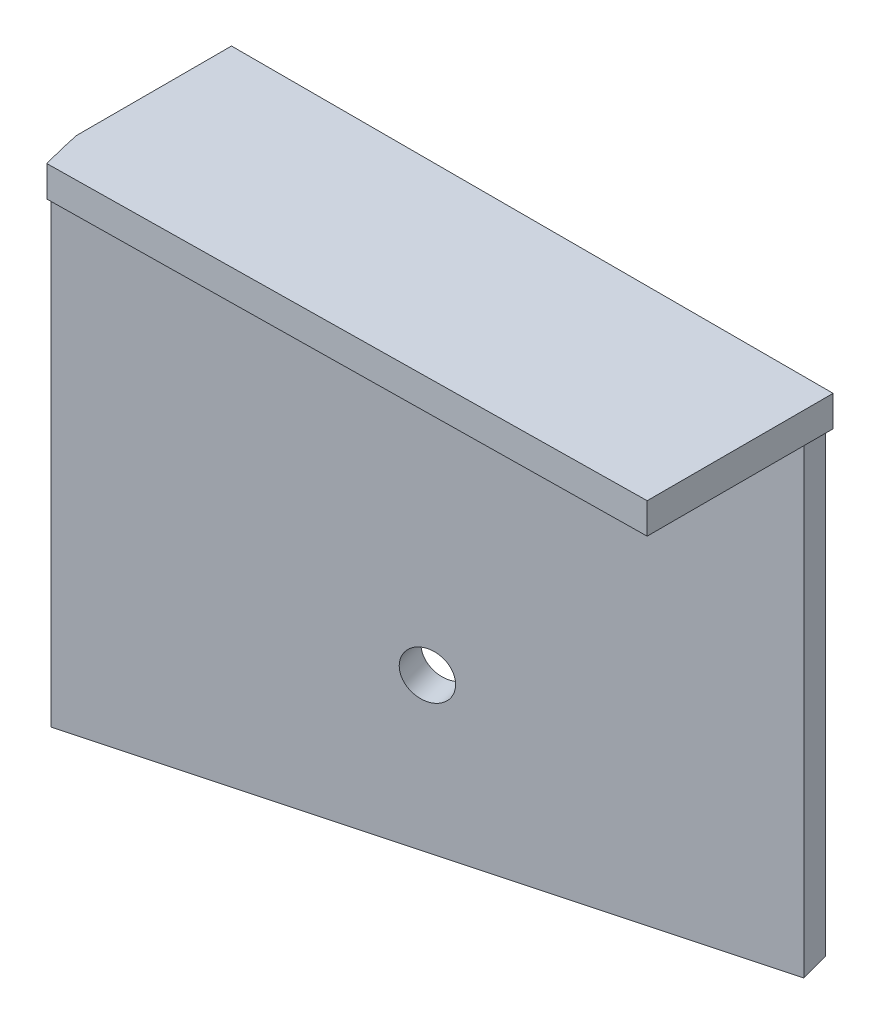
ISO-10303-21;
HEADER;
FILE_DESCRIPTION(('STEP AP214'),'2;1');
FILE_NAME('part.step','',(''),(''),'','','');
FILE_SCHEMA(('AUTOMOTIVE_DESIGN { 1 0 10303 214 1 1 1 1 }'));
ENDSEC;
DATA;
#1=APPLICATION_CONTEXT('core data for automotive mechanical design processes');
#2=APPLICATION_PROTOCOL_DEFINITION('international standard','automotive_design',2000,#1);
#3=PRODUCT_CONTEXT('',#1,'mechanical');
#4=PRODUCT('Part','Part','',(#3));
#5=PRODUCT_RELATED_PRODUCT_CATEGORY('part','',(#4));
#6=PRODUCT_DEFINITION_FORMATION('','',#4);
#7=PRODUCT_DEFINITION_CONTEXT('part definition',#1,'design');
#8=PRODUCT_DEFINITION('design','',#6,#7);
#9=PRODUCT_DEFINITION_SHAPE('','',#8);
#10=(LENGTH_UNIT() NAMED_UNIT(*) SI_UNIT(.MILLI.,.METRE.));
#11=(NAMED_UNIT(*) PLANE_ANGLE_UNIT() SI_UNIT($,.RADIAN.));
#12=(NAMED_UNIT(*) SI_UNIT($,.STERADIAN.) SOLID_ANGLE_UNIT());
#13=UNCERTAINTY_MEASURE_WITH_UNIT(LENGTH_MEASURE(1.E-05),#10,'distance_accuracy_value','');
#14=(GEOMETRIC_REPRESENTATION_CONTEXT(3) GLOBAL_UNCERTAINTY_ASSIGNED_CONTEXT((#13)) GLOBAL_UNIT_ASSIGNED_CONTEXT((#10,
#11,#12)) REPRESENTATION_CONTEXT('',''));
#15=CARTESIAN_POINT('',(0.,0.,0.));
#16=DIRECTION('',(0.,0.,1.));
#17=DIRECTION('',(1.,0.,0.));
#18=AXIS2_PLACEMENT_3D('',#15,#16,#17);
#19=CARTESIAN_POINT('',(0.,0.,0.));
#20=DIRECTION('',(0.,1.,0.));
#21=DIRECTION('',(0.,0.,1.));
#22=AXIS2_PLACEMENT_3D('',#19,#20,#21);
#23=PLANE('',#22);
#24=DIRECTION('',(0.,0.,1.));
#25=VECTOR('',#24,1.);
#26=CARTESIAN_POINT('',(-78.3093422835355,0.,16.8418203030454));
#27=LINE('',#26,#25);
#28=CARTESIAN_POINT('',(-78.3093422835355,0.,-3.81861528747266));
#29=VERTEX_POINT('',#28);
#30=CARTESIAN_POINT('',(-78.3093422835355,0.,16.3599178213118));
#31=VERTEX_POINT('',#30);
#32=EDGE_CURVE('E158',#29,#31,#27,.T.);
#33=ORIENTED_EDGE('',*,*,#32,.F.);
#34=DIRECTION('',(-1.,0.,0.));
#35=VECTOR('',#34,1.);
#36=CARTESIAN_POINT('',(-1.20354695321788,0.,-3.81861528747266));
#37=LINE('',#36,#35);
#38=CARTESIAN_POINT('',(-1.2035469532179,0.,-3.81861528747266));
#39=VERTEX_POINT('',#38);
#40=EDGE_CURVE('E55',#39,#29,#37,.T.);
#41=ORIENTED_EDGE('',*,*,#40,.F.);
#42=DIRECTION('',(0.965925826289068,0.,-0.258819045102521));
#43=VECTOR('',#42,1.);
#44=CARTESIAN_POINT('',(-1.03527618041008,0.,-3.86370330515627));
#45=LINE('',#44,#43);
#46=CARTESIAN_POINT('',(-78.2126892549614,0.,16.815922202093));
#47=VERTEX_POINT('',#46);
#48=EDGE_CURVE('E11',#47,#39,#45,.T.);
#49=ORIENTED_EDGE('',*,*,#48,.F.);
#50=CARTESIAN_POINT('',(0.,0.,0.));
#51=DIRECTION('',(0.,1.,0.));
#52=DIRECTION('',(0.,0.,1.));
#53=AXIS2_PLACEMENT_3D('',#50,#51,#52);
#54=CIRCLE('',#53,80.);
#55=EDGE_CURVE('E41',#31,#47,#54,.T.);
#56=ORIENTED_EDGE('',*,*,#55,.F.);
#57=EDGE_LOOP('',(#33,#41,#49,#56));
#58=FACE_BOUND('',#57,.T.);
#59=ADVANCED_FACE('F37',(#58),#23,.F.);
#60=CARTESIAN_POINT('',(-77.2740661031254,4.,20.7055236082017));
#61=DIRECTION('',(-0.258819045102522,0.,-0.965925826289068));
#62=DIRECTION('',(-0.965925826289068,0.,0.258819045102522));
#63=AXIS2_PLACEMENT_3D('',#60,#61,#62);
#64=PLANE('',#63);
#65=CARTESIAN_POINT('',(-38.6370330515627,-40.,10.3527618041009));
#66=DIRECTION('',(-0.258819045102522,0.,-0.965925826289068));
#67=DIRECTION('',(-0.965925826289068,0.,0.258819045102522));
#68=AXIS2_PLACEMENT_3D('',#65,#66,#67);
#69=CIRCLE('',#68,3.00000000000001);
#70=CARTESIAN_POINT('',(-41.5348105304299,-40.,11.1292189394084));
#71=VERTEX_POINT('',#70);
#72=EDGE_CURVE('E177',#71,#71,#69,.T.);
#73=ORIENTED_EDGE('',*,*,#72,.T.);
#74=EDGE_LOOP('',(#73));
#75=FACE_BOUND('',#74,.T.);
#76=DIRECTION('',(-0.965925826289068,0.,0.258819045102521));
#77=VECTOR('',#76,1.);
#78=CARTESIAN_POINT('',(0.,0.,0.));
#79=LINE('',#78,#77);
#80=CARTESIAN_POINT('',(0.,0.,0.));
#81=VERTEX_POINT('',#80);
#82=CARTESIAN_POINT('',(-77.2740661031254,0.,20.7055236082017));
#83=VERTEX_POINT('',#82);
#84=EDGE_CURVE('E167',#81,#83,#79,.T.);
#85=ORIENTED_EDGE('',*,*,#84,.T.);
#86=DIRECTION('',(0.,1.,0.));
#87=VECTOR('',#86,1.);
#88=CARTESIAN_POINT('',(-77.2740661031254,-60.,20.7055236082017));
#89=LINE('',#88,#87);
#90=CARTESIAN_POINT('',(-77.2740661031254,-60.,20.7055236082017));
#91=VERTEX_POINT('',#90);
#92=EDGE_CURVE('E200',#91,#83,#89,.T.);
#93=ORIENTED_EDGE('',*,*,#92,.F.);
#94=DIRECTION('',(-0.965925826289068,0.,0.258819045102521));
#95=VECTOR('',#94,1.);
#96=CARTESIAN_POINT('',(0.,-60.,0.));
#97=LINE('',#96,#95);
#98=CARTESIAN_POINT('',(0.,-60.,0.));
#99=VERTEX_POINT('',#98);
#100=EDGE_CURVE('E183',#99,#91,#97,.T.);
#101=ORIENTED_EDGE('',*,*,#100,.F.);
#102=DIRECTION('',(0.,1.,0.));
#103=VECTOR('',#102,1.);
#104=CARTESIAN_POINT('',(0.,-60.,0.));
#105=LINE('',#104,#103);
#106=EDGE_CURVE('E203',#99,#81,#105,.T.);
#107=ORIENTED_EDGE('',*,*,#106,.T.);
#108=EDGE_LOOP('',(#85,#93,#101,#107));
#109=FACE_BOUND('',#108,.T.);
#110=ADVANCED_FACE('F39',(#75,#109),#64,.F.);
#111=DIRECTION('',(0.258819045102521,0.,0.965925826289068));
#112=VECTOR('',#111,1.);
#113=CARTESIAN_POINT('',(0.,0.,0.));
#114=LINE('',#113,#112);
#115=CARTESIAN_POINT('',(-1.02319488248344,0.,-3.81861528747266));
#116=VERTEX_POINT('',#115);
#117=EDGE_CURVE('E138',#116,#81,#114,.T.);
#118=ORIENTED_EDGE('',*,*,#117,.F.);
#119=CARTESIAN_POINT('',(0.,0.,-3.81861528747266));
#120=VERTEX_POINT('',#119);
#121=EDGE_CURVE('E123',#120,#116,#37,.T.);
#122=ORIENTED_EDGE('',*,*,#121,.F.);
#123=DIRECTION('',(0.,0.,1.));
#124=VECTOR('',#123,1.);
#125=CARTESIAN_POINT('',(0.,0.,-10.));
#126=LINE('',#125,#124);
#127=EDGE_CURVE('E136',#120,#81,#126,.T.);
#128=ORIENTED_EDGE('',*,*,#127,.T.);
#129=EDGE_LOOP('',(#118,#122,#128));
#130=FACE_BOUND('',#129,.T.);
#131=ADVANCED_FACE('F135',(#130),#23,.F.);
#132=CARTESIAN_POINT('',(0.,4.,0.));
#133=DIRECTION('',(0.,-1.,0.));
#134=DIRECTION('',(0.,0.,-1.));
#135=AXIS2_PLACEMENT_3D('',#132,#133,#134);
#136=CYLINDRICAL_SURFACE('',#135,80.);
#137=CARTESIAN_POINT('',(0.,0.,0.));
#138=DIRECTION('',(0.,1.,0.));
#139=DIRECTION('',(0.,0.,1.));
#140=AXIS2_PLACEMENT_3D('',#137,#138,#139);
#141=CIRCLE('',#140,80.);
#142=CARTESIAN_POINT('',(-77.0699659435428,0.,21.4527468978019));
#143=VERTEX_POINT('',#142);
#144=EDGE_CURVE('E170',#83,#143,#141,.T.);
#145=ORIENTED_EDGE('',*,*,#144,.T.);
#146=DIRECTION('',(0.,-1.,0.));
#147=VECTOR('',#146,1.);
#148=CARTESIAN_POINT('',(-77.0699659435428,4.,21.4527468978019));
#149=LINE('',#148,#147);
#150=CARTESIAN_POINT('',(-77.0699659435428,4.,21.4527468978019));
#151=VERTEX_POINT('',#150);
#152=EDGE_CURVE('E63',#143,#151,#149,.F.);
#153=ORIENTED_EDGE('',*,*,#152,.T.);
#154=CARTESIAN_POINT('',(0.,4.,0.));
#155=DIRECTION('',(0.,1.,0.));
#156=DIRECTION('',(0.,0.,1.));
#157=AXIS2_PLACEMENT_3D('',#154,#155,#156);
#158=CIRCLE('',#157,80.);
#159=CARTESIAN_POINT('',(-78.3093422835355,4.,16.3599178213118));
#160=VERTEX_POINT('',#159);
#161=EDGE_CURVE('E46',#160,#151,#158,.T.);
#162=ORIENTED_EDGE('',*,*,#161,.F.);
#163=DIRECTION('',(0.,-1.,0.));
#164=VECTOR('',#163,1.);
#165=CARTESIAN_POINT('',(-78.3093422835355,4.,16.3599178213118));
#166=LINE('',#165,#164);
#167=EDGE_CURVE('E161',#160,#31,#166,.T.);
#168=ORIENTED_EDGE('',*,*,#167,.T.);
#169=ORIENTED_EDGE('',*,*,#55,.T.);
#170=EDGE_CURVE('E205',#47,#83,#54,.T.);
#171=ORIENTED_EDGE('',*,*,#170,.T.);
#172=EDGE_LOOP('',(#145,#153,#162,#168,#169,#171));
#173=FACE_BOUND('',#172,.T.);
#174=ADVANCED_FACE('F215',(#173),#136,.T.);
#175=CARTESIAN_POINT('',(0.,4.,0.));
#176=DIRECTION('',(0.,1.,0.));
#177=DIRECTION('',(0.,0.,1.));
#178=AXIS2_PLACEMENT_3D('',#175,#176,#177);
#179=PLANE('',#178);
#180=DIRECTION('',(1.,0.,0.));
#181=VECTOR('',#180,1.);
#182=CARTESIAN_POINT('',(0.,4.,-3.81861528747266));
#183=LINE('',#182,#181);
#184=CARTESIAN_POINT('',(-78.3093422835355,4.,-3.81861528747266));
#185=VERTEX_POINT('',#184);
#186=CARTESIAN_POINT('',(0.,4.,-3.81861528747266));
#187=VERTEX_POINT('',#186);
#188=EDGE_CURVE('E126',#185,#187,#183,.T.);
#189=ORIENTED_EDGE('',*,*,#188,.F.);
#190=DIRECTION('',(0.,0.,1.));
#191=VECTOR('',#190,1.);
#192=CARTESIAN_POINT('',(-78.3093422835355,4.,16.8418203030454));
#193=LINE('',#192,#191);
#194=EDGE_CURVE('E159',#185,#160,#193,.T.);
#195=ORIENTED_EDGE('',*,*,#194,.T.);
#196=ORIENTED_EDGE('',*,*,#161,.T.);
#197=DIRECTION('',(-0.999904258294916,0.,0.0138374218586422));
#198=VECTOR('',#197,1.);
#199=CARTESIAN_POINT('',(0.282065374417977,4.,20.3822917216286));
#200=LINE('',#199,#198);
#201=CARTESIAN_POINT('',(0.,4.,20.3861951529273));
#202=VERTEX_POINT('',#201);
#203=EDGE_CURVE('E155',#202,#151,#200,.T.);
#204=ORIENTED_EDGE('',*,*,#203,.F.);
#205=DIRECTION('',(0.,0.,-1.));
#206=VECTOR('',#205,1.);
#207=CARTESIAN_POINT('',(0.,4.,0.));
#208=LINE('',#207,#206);
#209=EDGE_CURVE('E165',#202,#187,#208,.T.);
#210=ORIENTED_EDGE('',*,*,#209,.T.);
#211=EDGE_LOOP('',(#189,#195,#196,#204,#210));
#212=FACE_BOUND('',#211,.T.);
#213=ADVANCED_FACE('F247',(#212),#179,.T.);
#214=CARTESIAN_POINT('',(0.,0.,0.));
#215=DIRECTION('',(0.,1.,0.));
#216=DIRECTION('',(0.,0.,1.));
#217=AXIS2_PLACEMENT_3D('',#214,#215,#216);
#218=PLANE('',#217);
#219=ORIENTED_EDGE('',*,*,#170,.F.);
#220=CARTESIAN_POINT('',(-78.3093422835355,0.,16.8418203030454));
#221=VERTEX_POINT('',#220);
#222=EDGE_CURVE('E48',#221,#47,#45,.T.);
#223=ORIENTED_EDGE('',*,*,#222,.F.);
#224=DIRECTION('',(-0.258819045102519,0.,-0.965925826289069));
#225=VECTOR('',#224,1.);
#226=CARTESIAN_POINT('',(-77.2740661031254,0.,20.7055236082017));
#227=LINE('',#226,#225);
#228=EDGE_CURVE('E192',#83,#221,#227,.T.);
#229=ORIENTED_EDGE('',*,*,#228,.F.);
#230=EDGE_LOOP('',(#219,#223,#229));
#231=FACE_BOUND('',#230,.T.);
#232=ADVANCED_FACE('F225',(#231),#218,.T.);
#233=CARTESIAN_POINT('',(0.,-60.,0.));
#234=DIRECTION('',(-0.965925826289068,0.,0.258819045102521));
#235=DIRECTION('',(0.258819045102521,0.,0.965925826289068));
#236=AXIS2_PLACEMENT_3D('',#233,#234,#235);
#237=PLANE('',#236);
#238=CARTESIAN_POINT('',(-1.03527618041008,0.,-3.86370330515627));
#239=VERTEX_POINT('',#238);
#240=EDGE_CURVE('E190',#239,#116,#114,.T.);
#241=ORIENTED_EDGE('',*,*,#240,.T.);
#242=ORIENTED_EDGE('',*,*,#117,.T.);
#243=ORIENTED_EDGE('',*,*,#106,.F.);
#244=DIRECTION('',(0.258819045102521,0.,0.965925826289068));
#245=VECTOR('',#244,1.);
#246=CARTESIAN_POINT('',(0.,-60.,0.));
#247=LINE('',#246,#245);
#248=CARTESIAN_POINT('',(-1.03527618041008,-60.,-3.86370330515627));
#249=VERTEX_POINT('',#248);
#250=EDGE_CURVE('E180',#249,#99,#247,.T.);
#251=ORIENTED_EDGE('',*,*,#250,.F.);
#252=DIRECTION('',(0.,1.,0.));
#253=VECTOR('',#252,1.);
#254=CARTESIAN_POINT('',(-1.03527618041008,-60.,-3.86370330515627));
#255=LINE('',#254,#253);
#256=EDGE_CURVE('E189',#249,#239,#255,.T.);
#257=ORIENTED_EDGE('',*,*,#256,.T.);
#258=EDGE_LOOP('',(#241,#242,#243,#251,#257));
#259=FACE_BOUND('',#258,.T.);
#260=ADVANCED_FACE('F236',(#259),#237,.F.);
#261=CARTESIAN_POINT('',(-77.2740661031254,-60.,20.7055236082017));
#262=DIRECTION('',(0.965925826289069,0.,-0.258819045102519));
#263=DIRECTION('',(-0.258819045102519,0.,-0.965925826289069));
#264=AXIS2_PLACEMENT_3D('',#261,#262,#263);
#265=PLANE('',#264);
#266=ORIENTED_EDGE('',*,*,#228,.T.);
#267=DIRECTION('',(0.,1.,0.));
#268=VECTOR('',#267,1.);
#269=CARTESIAN_POINT('',(-78.3093422835355,-60.,16.8418203030454));
#270=LINE('',#269,#268);
#271=CARTESIAN_POINT('',(-78.3093422835355,-60.,16.8418203030454));
#272=VERTEX_POINT('',#271);
#273=EDGE_CURVE('E197',#272,#221,#270,.T.);
#274=ORIENTED_EDGE('',*,*,#273,.F.);
#275=DIRECTION('',(-0.258819045102519,0.,-0.965925826289069));
#276=VECTOR('',#275,1.);
#277=CARTESIAN_POINT('',(-77.2740661031254,-60.,20.7055236082017));
#278=LINE('',#277,#276);
#279=EDGE_CURVE('E185',#91,#272,#278,.T.);
#280=ORIENTED_EDGE('',*,*,#279,.F.);
#281=ORIENTED_EDGE('',*,*,#92,.T.);
#282=EDGE_LOOP('',(#266,#274,#280,#281));
#283=FACE_BOUND('',#282,.T.);
#284=ADVANCED_FACE('F222',(#283),#265,.F.);
#285=CARTESIAN_POINT('',(-1.03527618041008,-60.,-3.86370330515627));
#286=DIRECTION('',(0.258819045102521,0.,0.965925826289068));
#287=DIRECTION('',(0.965925826289068,0.,-0.258819045102521));
#288=AXIS2_PLACEMENT_3D('',#285,#286,#287);
#289=PLANE('',#288);
#290=CARTESIAN_POINT('',(-39.6723092319728,-40.,6.48905849894458));
#291=DIRECTION('',(-0.258819045102521,0.,-0.965925826289068));
#292=DIRECTION('',(-0.965925826289068,0.,0.258819045102521));
#293=AXIS2_PLACEMENT_3D('',#290,#291,#292);
#294=CIRCLE('',#293,3.00000000000001);
#295=CARTESIAN_POINT('',(-42.57008671084,-40.,7.26551563425214));
#296=VERTEX_POINT('',#295);
#297=EDGE_CURVE('E173',#296,#296,#294,.T.);
#298=ORIENTED_EDGE('',*,*,#297,.F.);
#299=EDGE_LOOP('',(#298));
#300=FACE_BOUND('',#299,.T.);
#301=ORIENTED_EDGE('',*,*,#222,.T.);
#302=ORIENTED_EDGE('',*,*,#48,.T.);
#303=DIRECTION('',(0.965925826289068,0.,-0.258819045102521));
#304=VECTOR('',#303,1.);
#305=CARTESIAN_POINT('',(-1.03527618041008,0.,-3.86370330515627));
#306=LINE('',#305,#304);
#307=EDGE_CURVE('E131',#39,#239,#306,.T.);
#308=ORIENTED_EDGE('',*,*,#307,.T.);
#309=ORIENTED_EDGE('',*,*,#256,.F.);
#310=DIRECTION('',(0.965925826289068,0.,-0.258819045102521));
#311=VECTOR('',#310,1.);
#312=CARTESIAN_POINT('',(-1.03527618041008,-60.,-3.86370330515627));
#313=LINE('',#312,#311);
#314=EDGE_CURVE('E187',#272,#249,#313,.T.);
#315=ORIENTED_EDGE('',*,*,#314,.F.);
#316=ORIENTED_EDGE('',*,*,#273,.T.);
#317=EDGE_LOOP('',(#301,#302,#308,#309,#315,#316));
#318=FACE_BOUND('',#317,.T.);
#319=ADVANCED_FACE('F227',(#300,#318),#289,.F.);
#320=CARTESIAN_POINT('',(0.,-60.,0.));
#321=DIRECTION('',(0.,1.,0.));
#322=DIRECTION('',(0.,0.,1.));
#323=AXIS2_PLACEMENT_3D('',#320,#321,#322);
#324=PLANE('',#323);
#325=ORIENTED_EDGE('',*,*,#250,.T.);
#326=ORIENTED_EDGE('',*,*,#100,.T.);
#327=ORIENTED_EDGE('',*,*,#279,.T.);
#328=ORIENTED_EDGE('',*,*,#314,.T.);
#329=EDGE_LOOP('',(#325,#326,#327,#328));
#330=FACE_BOUND('',#329,.T.);
#331=ADVANCED_FACE('F233',(#330),#324,.F.);
#332=CARTESIAN_POINT('',(-19.2256046688736,-40.,82.797198775781));
#333=DIRECTION('',(-0.258819045102521,0.,-0.965925826289068));
#334=DIRECTION('',(-0.965925826289068,0.,0.258819045102521));
#335=AXIS2_PLACEMENT_3D('',#332,#333,#334);
#336=CYLINDRICAL_SURFACE('',#335,3.00000000000001);
#337=ORIENTED_EDGE('',*,*,#297,.T.);
#338=EDGE_LOOP('',(#337));
#339=FACE_BOUND('',#338,.T.);
#340=ORIENTED_EDGE('',*,*,#72,.F.);
#341=EDGE_LOOP('',(#340));
#342=FACE_BOUND('',#341,.T.);
#343=ADVANCED_FACE('F288',(#339,#342),#336,.F.);
#344=CARTESIAN_POINT('',(0.,0.,0.));
#345=DIRECTION('',(1.,0.,0.));
#346=DIRECTION('',(0.,0.,-1.));
#347=AXIS2_PLACEMENT_3D('',#344,#345,#346);
#348=PLANE('',#347);
#349=DIRECTION('',(0.,-1.,0.));
#350=VECTOR('',#349,1.);
#351=CARTESIAN_POINT('',(0.,0.,-3.81861528747266));
#352=LINE('',#351,#350);
#353=EDGE_CURVE('E120',#187,#120,#352,.T.);
#354=ORIENTED_EDGE('',*,*,#353,.F.);
#355=ORIENTED_EDGE('',*,*,#209,.F.);
#356=DIRECTION('',(0.,-1.,0.));
#357=VECTOR('',#356,1.);
#358=CARTESIAN_POINT('',(0.,10.,20.3861951529273));
#359=LINE('',#358,#357);
#360=CARTESIAN_POINT('',(0.,0.,20.3861951529273));
#361=VERTEX_POINT('',#360);
#362=EDGE_CURVE('E150',#202,#361,#359,.T.);
#363=ORIENTED_EDGE('',*,*,#362,.T.);
#364=DIRECTION('',(0.,0.,-1.));
#365=VECTOR('',#364,1.);
#366=CARTESIAN_POINT('',(0.,0.,0.));
#367=LINE('',#366,#365);
#368=EDGE_CURVE('E146',#361,#81,#367,.T.);
#369=ORIENTED_EDGE('',*,*,#368,.T.);
#370=ORIENTED_EDGE('',*,*,#127,.F.);
#371=EDGE_LOOP('',(#354,#355,#363,#369,#370));
#372=FACE_BOUND('',#371,.T.);
#373=ADVANCED_FACE('F143',(#372),#348,.T.);
#374=CARTESIAN_POINT('',(0.,0.,0.));
#375=DIRECTION('',(0.,1.,0.));
#376=DIRECTION('',(0.,0.,1.));
#377=AXIS2_PLACEMENT_3D('',#374,#375,#376);
#378=PLANE('',#377);
#379=ORIENTED_EDGE('',*,*,#368,.F.);
#380=DIRECTION('',(0.999904258294916,0.,-0.0138374218586422));
#381=VECTOR('',#380,1.);
#382=CARTESIAN_POINT('',(-81.8992414803574,0.,21.5195780192019));
#383=LINE('',#382,#381);
#384=EDGE_CURVE('E148',#143,#361,#383,.T.);
#385=ORIENTED_EDGE('',*,*,#384,.F.);
#386=ORIENTED_EDGE('',*,*,#144,.F.);
#387=ORIENTED_EDGE('',*,*,#84,.F.);
#388=EDGE_LOOP('',(#379,#385,#386,#387));
#389=FACE_BOUND('',#388,.T.);
#390=ADVANCED_FACE('F249',(#389),#378,.F.);
#391=CARTESIAN_POINT('',(-78.3093422835355,4.,16.8418203030454));
#392=DIRECTION('',(1.,0.,0.));
#393=DIRECTION('',(0.,0.,-1.));
#394=AXIS2_PLACEMENT_3D('',#391,#392,#393);
#395=PLANE('',#394);
#396=ORIENTED_EDGE('',*,*,#194,.F.);
#397=DIRECTION('',(0.,-1.,0.));
#398=VECTOR('',#397,1.);
#399=CARTESIAN_POINT('',(-78.3093422835355,10.,-3.81861528747266));
#400=LINE('',#399,#398);
#401=EDGE_CURVE('E140',#185,#29,#400,.T.);
#402=ORIENTED_EDGE('',*,*,#401,.T.);
#403=ORIENTED_EDGE('',*,*,#32,.T.);
#404=ORIENTED_EDGE('',*,*,#167,.F.);
#405=EDGE_LOOP('',(#396,#402,#403,#404));
#406=FACE_BOUND('',#405,.T.);
#407=ADVANCED_FACE('F246',(#406),#395,.F.);
#408=CARTESIAN_POINT('',(-81.8992414803574,10.,21.5195780192019));
#409=DIRECTION('',(-0.0138374218586422,0.,-0.999904258294916));
#410=DIRECTION('',(-0.999904258294916,0.,0.0138374218586422));
#411=AXIS2_PLACEMENT_3D('',#408,#409,#410);
#412=PLANE('',#411);
#413=ORIENTED_EDGE('',*,*,#384,.T.);
#414=ORIENTED_EDGE('',*,*,#362,.F.);
#415=ORIENTED_EDGE('',*,*,#203,.T.);
#416=ORIENTED_EDGE('',*,*,#152,.F.);
#417=EDGE_LOOP('',(#413,#414,#415,#416));
#418=FACE_BOUND('',#417,.T.);
#419=ADVANCED_FACE('F250',(#418),#412,.F.);
#420=CARTESIAN_POINT('',(0.,0.,0.));
#421=DIRECTION('',(0.,-1.,0.));
#422=DIRECTION('',(0.,0.,-1.));
#423=AXIS2_PLACEMENT_3D('',#420,#421,#422);
#424=PLANE('',#423);
#425=ORIENTED_EDGE('',*,*,#307,.F.);
#426=EDGE_CURVE('E141',#116,#39,#37,.T.);
#427=ORIENTED_EDGE('',*,*,#426,.F.);
#428=ORIENTED_EDGE('',*,*,#240,.F.);
#429=EDGE_LOOP('',(#425,#427,#428));
#430=FACE_BOUND('',#429,.T.);
#431=ADVANCED_FACE('F238',(#430),#424,.F.);
#432=CARTESIAN_POINT('',(-1.20354695321788,10.,-3.81861528747266));
#433=DIRECTION('',(0.,0.,1.));
#434=DIRECTION('',(1.,0.,0.));
#435=AXIS2_PLACEMENT_3D('',#432,#433,#434);
#436=PLANE('',#435);
#437=ORIENTED_EDGE('',*,*,#188,.T.);
#438=ORIENTED_EDGE('',*,*,#353,.T.);
#439=ORIENTED_EDGE('',*,*,#121,.T.);
#440=ORIENTED_EDGE('',*,*,#426,.T.);
#441=ORIENTED_EDGE('',*,*,#40,.T.);
#442=ORIENTED_EDGE('',*,*,#401,.F.);
#443=EDGE_LOOP('',(#437,#438,#439,#440,#441,#442));
#444=FACE_BOUND('',#443,.T.);
#445=ADVANCED_FACE('F122',(#444),#436,.F.);
#446=CLOSED_SHELL('',(#59,#110,#131,#174,#213,#232,#260,#284,#319,#331,#343,#373,#390,#407,#419,
#431,#445));
#447=MANIFOLD_SOLID_BREP('B2',#446);
#448=ADVANCED_BREP_SHAPE_REPRESENTATION('',(#18,#447),#14);
#449=SHAPE_DEFINITION_REPRESENTATION(#9,#448);
ENDSEC;
END-ISO-10303-21;
